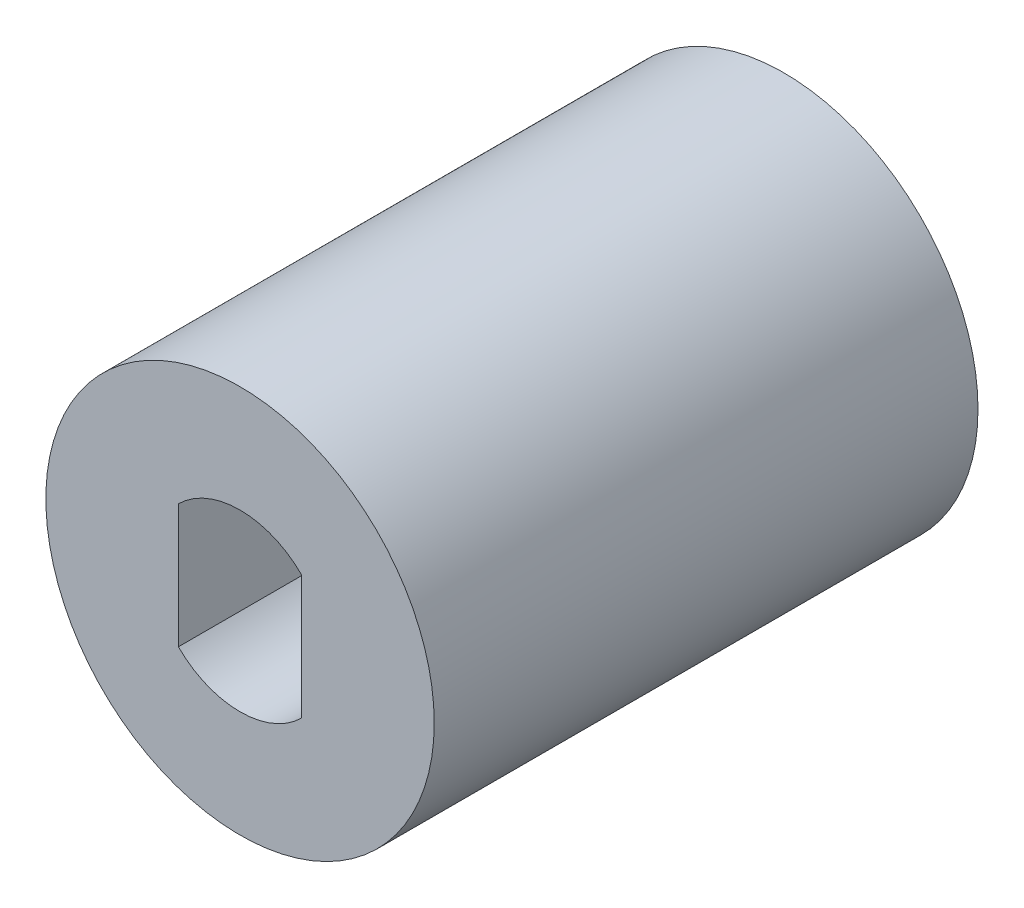
ISO-10303-21;
HEADER;
FILE_DESCRIPTION(('STEP AP214'),'2;1');
FILE_NAME('part.step','',(''),(''),'','','');
FILE_SCHEMA(('AUTOMOTIVE_DESIGN { 1 0 10303 214 1 1 1 1 }'));
ENDSEC;
DATA;
#1=APPLICATION_CONTEXT('core data for automotive mechanical design processes');
#2=APPLICATION_PROTOCOL_DEFINITION('international standard','automotive_design',2000,#1);
#3=PRODUCT_CONTEXT('',#1,'mechanical');
#4=PRODUCT('Part','Part','',(#3));
#5=PRODUCT_RELATED_PRODUCT_CATEGORY('part','',(#4));
#6=PRODUCT_DEFINITION_FORMATION('','',#4);
#7=PRODUCT_DEFINITION_CONTEXT('part definition',#1,'design');
#8=PRODUCT_DEFINITION('design','',#6,#7);
#9=PRODUCT_DEFINITION_SHAPE('','',#8);
#10=(LENGTH_UNIT() NAMED_UNIT(*) SI_UNIT(.MILLI.,.METRE.));
#11=(NAMED_UNIT(*) PLANE_ANGLE_UNIT() SI_UNIT($,.RADIAN.));
#12=(NAMED_UNIT(*) SI_UNIT($,.STERADIAN.) SOLID_ANGLE_UNIT());
#13=UNCERTAINTY_MEASURE_WITH_UNIT(LENGTH_MEASURE(1.E-05),#10,'distance_accuracy_value','');
#14=(GEOMETRIC_REPRESENTATION_CONTEXT(3) GLOBAL_UNCERTAINTY_ASSIGNED_CONTEXT((#13)) GLOBAL_UNIT_ASSIGNED_CONTEXT((#10,
#11,#12)) REPRESENTATION_CONTEXT('',''));
#15=CARTESIAN_POINT('',(0.,0.,0.));
#16=DIRECTION('',(0.,0.,1.));
#17=DIRECTION('',(1.,0.,0.));
#18=AXIS2_PLACEMENT_3D('',#15,#16,#17);
#19=CARTESIAN_POINT('',(0.,0.,14.));
#20=DIRECTION('',(0.,0.,-1.));
#21=DIRECTION('',(-1.,0.,0.));
#22=AXIS2_PLACEMENT_3D('',#19,#20,#21);
#23=CYLINDRICAL_SURFACE('',#22,5.);
#24=DIRECTION('',(0.,0.,-1.));
#25=VECTOR('',#24,1.);
#26=CARTESIAN_POINT('',(4.,3.,14.));
#27=LINE('',#26,#25);
#28=CARTESIAN_POINT('',(4.,3.,-5.));
#29=VERTEX_POINT('',#28);
#30=CARTESIAN_POINT('',(4.,3.,-14.));
#31=VERTEX_POINT('',#30);
#32=EDGE_CURVE('E58',#29,#31,#27,.T.);
#33=ORIENTED_EDGE('',*,*,#32,.F.);
#34=CARTESIAN_POINT('',(0.,0.,-5.));
#35=DIRECTION('',(0.,0.,1.));
#36=DIRECTION('',(1.,0.,0.));
#37=AXIS2_PLACEMENT_3D('',#34,#35,#36);
#38=CIRCLE('',#37,5.);
#39=CARTESIAN_POINT('',(4.,-3.,-5.));
#40=VERTEX_POINT('',#39);
#41=EDGE_CURVE('E52',#29,#40,#38,.T.);
#42=ORIENTED_EDGE('',*,*,#41,.T.);
#43=DIRECTION('',(0.,0.,-1.));
#44=VECTOR('',#43,1.);
#45=CARTESIAN_POINT('',(4.,-3.,14.));
#46=LINE('',#45,#44);
#47=CARTESIAN_POINT('',(4.,-3.,-14.));
#48=VERTEX_POINT('',#47);
#49=EDGE_CURVE('E141',#40,#48,#46,.T.);
#50=ORIENTED_EDGE('',*,*,#49,.T.);
#51=CARTESIAN_POINT('',(0.,0.,-14.));
#52=DIRECTION('',(0.,0.,1.));
#53=DIRECTION('',(1.,0.,0.));
#54=AXIS2_PLACEMENT_3D('',#51,#52,#53);
#55=CIRCLE('',#54,5.);
#56=EDGE_CURVE('E134',#31,#48,#55,.T.);
#57=ORIENTED_EDGE('',*,*,#56,.F.);
#58=EDGE_LOOP('',(#33,#42,#50,#57));
#59=FACE_BOUND('',#58,.T.);
#60=ADVANCED_FACE('F38',(#59),#23,.F.);
#61=CARTESIAN_POINT('',(4.,3.,14.));
#62=DIRECTION('',(-1.,0.,0.));
#63=DIRECTION('',(0.,0.,1.));
#64=AXIS2_PLACEMENT_3D('',#61,#62,#63);
#65=PLANE('',#64);
#66=ORIENTED_EDGE('',*,*,#49,.F.);
#67=DIRECTION('',(0.,1.,0.));
#68=VECTOR('',#67,1.);
#69=CARTESIAN_POINT('',(4.,3.,-5.));
#70=LINE('',#69,#68);
#71=EDGE_CURVE('E11',#40,#29,#70,.T.);
#72=ORIENTED_EDGE('',*,*,#71,.T.);
#73=ORIENTED_EDGE('',*,*,#32,.T.);
#74=DIRECTION('',(0.,1.,0.));
#75=VECTOR('',#74,1.);
#76=CARTESIAN_POINT('',(4.,3.,-14.));
#77=LINE('',#76,#75);
#78=EDGE_CURVE('E137',#48,#31,#77,.T.);
#79=ORIENTED_EDGE('',*,*,#78,.F.);
#80=EDGE_LOOP('',(#66,#72,#73,#79));
#81=FACE_BOUND('',#80,.T.);
#82=ADVANCED_FACE('F155',(#81),#65,.T.);
#83=CARTESIAN_POINT('',(0.,0.,14.));
#84=DIRECTION('',(0.,0.,1.));
#85=DIRECTION('',(1.,0.,0.));
#86=AXIS2_PLACEMENT_3D('',#83,#84,#85);
#87=PLANE('',#86);
#88=CARTESIAN_POINT('',(0.,0.,14.));
#89=DIRECTION('',(0.,0.,1.));
#90=DIRECTION('',(1.,0.,0.));
#91=AXIS2_PLACEMENT_3D('',#88,#89,#90);
#92=CIRCLE('',#91,10.);
#93=CARTESIAN_POINT('',(10.,0.,14.));
#94=VERTEX_POINT('',#93);
#95=EDGE_CURVE('E46',#94,#94,#92,.T.);
#96=ORIENTED_EDGE('',*,*,#95,.T.);
#97=EDGE_LOOP('',(#96));
#98=FACE_BOUND('',#97,.T.);
#99=CARTESIAN_POINT('',(0.,0.,14.));
#100=DIRECTION('',(0.,0.,1.));
#101=DIRECTION('',(1.,0.,0.));
#102=AXIS2_PLACEMENT_3D('',#99,#100,#101);
#103=CIRCLE('',#102,4.5);
#104=CARTESIAN_POINT('',(3.175,3.1889457505577,14.));
#105=VERTEX_POINT('',#104);
#106=CARTESIAN_POINT('',(-3.175,3.1889457505577,14.));
#107=VERTEX_POINT('',#106);
#108=EDGE_CURVE('E101',#105,#107,#103,.T.);
#109=ORIENTED_EDGE('',*,*,#108,.F.);
#110=DIRECTION('',(0.,-1.,0.));
#111=VECTOR('',#110,1.);
#112=CARTESIAN_POINT('',(3.175,0.,14.));
#113=LINE('',#112,#111);
#114=CARTESIAN_POINT('',(3.175,-3.1889457505577,14.));
#115=VERTEX_POINT('',#114);
#116=EDGE_CURVE('E121',#105,#115,#113,.T.);
#117=ORIENTED_EDGE('',*,*,#116,.T.);
#118=CARTESIAN_POINT('',(-3.175,-3.1889457505577,14.));
#119=VERTEX_POINT('',#118);
#120=EDGE_CURVE('E115',#119,#115,#103,.T.);
#121=ORIENTED_EDGE('',*,*,#120,.F.);
#122=DIRECTION('',(0.,-1.,0.));
#123=VECTOR('',#122,1.);
#124=CARTESIAN_POINT('',(-3.175,0.,14.));
#125=LINE('',#124,#123);
#126=EDGE_CURVE('E110',#107,#119,#125,.T.);
#127=ORIENTED_EDGE('',*,*,#126,.F.);
#128=EDGE_LOOP('',(#109,#117,#121,#127));
#129=FACE_BOUND('',#128,.T.);
#130=ADVANCED_FACE('F152',(#98,#129),#87,.T.);
#131=CARTESIAN_POINT('',(0.,0.,-14.));
#132=DIRECTION('',(0.,0.,1.));
#133=DIRECTION('',(1.,0.,0.));
#134=AXIS2_PLACEMENT_3D('',#131,#132,#133);
#135=PLANE('',#134);
#136=CARTESIAN_POINT('',(0.,0.,-14.));
#137=DIRECTION('',(0.,0.,1.));
#138=DIRECTION('',(1.,0.,0.));
#139=AXIS2_PLACEMENT_3D('',#136,#137,#138);
#140=CIRCLE('',#139,10.);
#141=CARTESIAN_POINT('',(10.,0.,-14.));
#142=VERTEX_POINT('',#141);
#143=EDGE_CURVE('E143',#142,#142,#140,.T.);
#144=ORIENTED_EDGE('',*,*,#143,.F.);
#145=EDGE_LOOP('',(#144));
#146=FACE_BOUND('',#145,.T.);
#147=ORIENTED_EDGE('',*,*,#56,.T.);
#148=ORIENTED_EDGE('',*,*,#78,.T.);
#149=EDGE_LOOP('',(#147,#148));
#150=FACE_BOUND('',#149,.T.);
#151=ADVANCED_FACE('F149',(#146,#150),#135,.F.);
#152=CARTESIAN_POINT('',(0.,0.,14.));
#153=DIRECTION('',(0.,0.,-1.));
#154=DIRECTION('',(-1.,0.,0.));
#155=AXIS2_PLACEMENT_3D('',#152,#153,#154);
#156=CYLINDRICAL_SURFACE('',#155,10.);
#157=ORIENTED_EDGE('',*,*,#95,.F.);
#158=EDGE_LOOP('',(#157));
#159=FACE_BOUND('',#158,.T.);
#160=ORIENTED_EDGE('',*,*,#143,.T.);
#161=EDGE_LOOP('',(#160));
#162=FACE_BOUND('',#161,.T.);
#163=ADVANCED_FACE('F40',(#159,#162),#156,.T.);
#164=CARTESIAN_POINT('',(0.,0.,-5.));
#165=DIRECTION('',(0.,0.,1.));
#166=DIRECTION('',(1.,0.,0.));
#167=AXIS2_PLACEMENT_3D('',#164,#165,#166);
#168=CYLINDRICAL_SURFACE('',#167,6.);
#169=CARTESIAN_POINT('',(0.,0.,-5.));
#170=DIRECTION('',(0.,0.,1.));
#171=DIRECTION('',(1.,0.,0.));
#172=AXIS2_PLACEMENT_3D('',#169,#170,#171);
#173=CIRCLE('',#172,6.);
#174=CARTESIAN_POINT('',(6.,0.,-5.));
#175=VERTEX_POINT('',#174);
#176=EDGE_CURVE('E128',#175,#175,#173,.T.);
#177=ORIENTED_EDGE('',*,*,#176,.F.);
#178=EDGE_LOOP('',(#177));
#179=FACE_BOUND('',#178,.T.);
#180=CARTESIAN_POINT('',(0.,0.,5.));
#181=DIRECTION('',(0.,0.,1.));
#182=DIRECTION('',(1.,0.,0.));
#183=AXIS2_PLACEMENT_3D('',#180,#181,#182);
#184=CIRCLE('',#183,6.);
#185=CARTESIAN_POINT('',(6.,0.,5.));
#186=VERTEX_POINT('',#185);
#187=EDGE_CURVE('E127',#186,#186,#184,.T.);
#188=ORIENTED_EDGE('',*,*,#187,.T.);
#189=EDGE_LOOP('',(#188));
#190=FACE_BOUND('',#189,.T.);
#191=ADVANCED_FACE('F166',(#179,#190),#168,.F.);
#192=CARTESIAN_POINT('',(0.,0.,-5.));
#193=DIRECTION('',(0.,0.,1.));
#194=DIRECTION('',(1.,0.,0.));
#195=AXIS2_PLACEMENT_3D('',#192,#193,#194);
#196=PLANE('',#195);
#197=ORIENTED_EDGE('',*,*,#71,.F.);
#198=ORIENTED_EDGE('',*,*,#41,.F.);
#199=EDGE_LOOP('',(#197,#198));
#200=FACE_BOUND('',#199,.T.);
#201=ORIENTED_EDGE('',*,*,#176,.T.);
#202=EDGE_LOOP('',(#201));
#203=FACE_BOUND('',#202,.T.);
#204=ADVANCED_FACE('F169',(#200,#203),#196,.T.);
#205=CARTESIAN_POINT('',(0.,0.,5.));
#206=DIRECTION('',(0.,0.,1.));
#207=DIRECTION('',(1.,0.,0.));
#208=AXIS2_PLACEMENT_3D('',#205,#206,#207);
#209=PLANE('',#208);
#210=ORIENTED_EDGE('',*,*,#187,.F.);
#211=EDGE_LOOP('',(#210));
#212=FACE_BOUND('',#211,.T.);
#213=DIRECTION('',(0.,1.,0.));
#214=VECTOR('',#213,1.);
#215=CARTESIAN_POINT('',(-3.175,0.,5.));
#216=LINE('',#215,#214);
#217=CARTESIAN_POINT('',(-3.175,-3.1889457505577,5.));
#218=VERTEX_POINT('',#217);
#219=CARTESIAN_POINT('',(-3.175,3.1889457505577,5.));
#220=VERTEX_POINT('',#219);
#221=EDGE_CURVE('E90',#218,#220,#216,.T.);
#222=ORIENTED_EDGE('',*,*,#221,.F.);
#223=CARTESIAN_POINT('',(0.,0.,5.));
#224=DIRECTION('',(0.,0.,1.));
#225=DIRECTION('',(1.,0.,0.));
#226=AXIS2_PLACEMENT_3D('',#223,#224,#225);
#227=CIRCLE('',#226,4.5);
#228=CARTESIAN_POINT('',(3.175,-3.1889457505577,5.));
#229=VERTEX_POINT('',#228);
#230=EDGE_CURVE('E93',#229,#218,#227,.F.);
#231=ORIENTED_EDGE('',*,*,#230,.F.);
#232=DIRECTION('',(0.,1.,0.));
#233=VECTOR('',#232,1.);
#234=CARTESIAN_POINT('',(3.175,0.,5.));
#235=LINE('',#234,#233);
#236=CARTESIAN_POINT('',(3.175,3.1889457505577,5.));
#237=VERTEX_POINT('',#236);
#238=EDGE_CURVE('E125',#229,#237,#235,.T.);
#239=ORIENTED_EDGE('',*,*,#238,.T.);
#240=CARTESIAN_POINT('',(0.,0.,5.));
#241=DIRECTION('',(0.,0.,1.));
#242=DIRECTION('',(1.,0.,0.));
#243=AXIS2_PLACEMENT_3D('',#240,#241,#242);
#244=CIRCLE('',#243,4.5);
#245=EDGE_CURVE('E96',#220,#237,#244,.F.);
#246=ORIENTED_EDGE('',*,*,#245,.F.);
#247=EDGE_LOOP('',(#222,#231,#239,#246));
#248=FACE_BOUND('',#247,.T.);
#249=ADVANCED_FACE('F92',(#212,#248),#209,.F.);
#250=CARTESIAN_POINT('',(0.,0.,-8.79311422413372));
#251=DIRECTION('',(0.,0.,1.));
#252=DIRECTION('',(1.,0.,0.));
#253=AXIS2_PLACEMENT_3D('',#250,#251,#252);
#254=CYLINDRICAL_SURFACE('',#253,4.5);
#255=DIRECTION('',(0.,0.,1.));
#256=VECTOR('',#255,1.);
#257=CARTESIAN_POINT('',(-3.175,3.1889457505577,-8.79311422413372));
#258=LINE('',#257,#256);
#259=EDGE_CURVE('E100',#220,#107,#258,.T.);
#260=ORIENTED_EDGE('',*,*,#259,.F.);
#261=ORIENTED_EDGE('',*,*,#245,.T.);
#262=DIRECTION('',(0.,0.,1.));
#263=VECTOR('',#262,1.);
#264=CARTESIAN_POINT('',(3.175,3.1889457505577,-8.79311422413372));
#265=LINE('',#264,#263);
#266=EDGE_CURVE('E122',#237,#105,#265,.T.);
#267=ORIENTED_EDGE('',*,*,#266,.T.);
#268=ORIENTED_EDGE('',*,*,#108,.T.);
#269=EDGE_LOOP('',(#260,#261,#267,#268));
#270=FACE_BOUND('',#269,.T.);
#271=ADVANCED_FACE('F173',(#270),#254,.F.);
#272=CARTESIAN_POINT('',(-3.175,0.,-8.79311422413372));
#273=DIRECTION('',(-1.,0.,0.));
#274=DIRECTION('',(0.,0.,1.));
#275=AXIS2_PLACEMENT_3D('',#272,#273,#274);
#276=PLANE('',#275);
#277=DIRECTION('',(0.,0.,1.));
#278=VECTOR('',#277,1.);
#279=CARTESIAN_POINT('',(-3.175,-3.1889457505577,-8.79311422413372));
#280=LINE('',#279,#278);
#281=EDGE_CURVE('E106',#218,#119,#280,.T.);
#282=ORIENTED_EDGE('',*,*,#281,.F.);
#283=ORIENTED_EDGE('',*,*,#221,.T.);
#284=ORIENTED_EDGE('',*,*,#259,.T.);
#285=ORIENTED_EDGE('',*,*,#126,.T.);
#286=EDGE_LOOP('',(#282,#283,#284,#285));
#287=FACE_BOUND('',#286,.T.);
#288=ADVANCED_FACE('F112',(#287),#276,.F.);
#289=DIRECTION('',(0.,0.,1.));
#290=VECTOR('',#289,1.);
#291=CARTESIAN_POINT('',(3.175,-3.1889457505577,-8.79311422413372));
#292=LINE('',#291,#290);
#293=EDGE_CURVE('E108',#229,#115,#292,.T.);
#294=ORIENTED_EDGE('',*,*,#293,.F.);
#295=ORIENTED_EDGE('',*,*,#230,.T.);
#296=ORIENTED_EDGE('',*,*,#281,.T.);
#297=ORIENTED_EDGE('',*,*,#120,.T.);
#298=EDGE_LOOP('',(#294,#295,#296,#297));
#299=FACE_BOUND('',#298,.T.);
#300=ADVANCED_FACE('F104',(#299),#254,.F.);
#301=CARTESIAN_POINT('',(3.175,0.,-8.79311422413372));
#302=DIRECTION('',(-1.,0.,0.));
#303=DIRECTION('',(0.,0.,1.));
#304=AXIS2_PLACEMENT_3D('',#301,#302,#303);
#305=PLANE('',#304);
#306=ORIENTED_EDGE('',*,*,#238,.F.);
#307=ORIENTED_EDGE('',*,*,#293,.T.);
#308=ORIENTED_EDGE('',*,*,#116,.F.);
#309=ORIENTED_EDGE('',*,*,#266,.F.);
#310=EDGE_LOOP('',(#306,#307,#308,#309));
#311=FACE_BOUND('',#310,.T.);
#312=ADVANCED_FACE('F181',(#311),#305,.T.);
#313=CLOSED_SHELL('',(#60,#82,#130,#151,#163,#191,#204,#249,#271,#288,#300,#312));
#314=MANIFOLD_SOLID_BREP('B2',#313);
#315=ADVANCED_BREP_SHAPE_REPRESENTATION('',(#18,#314),#14);
#316=SHAPE_DEFINITION_REPRESENTATION(#9,#315);
ENDSEC;
END-ISO-10303-21;
